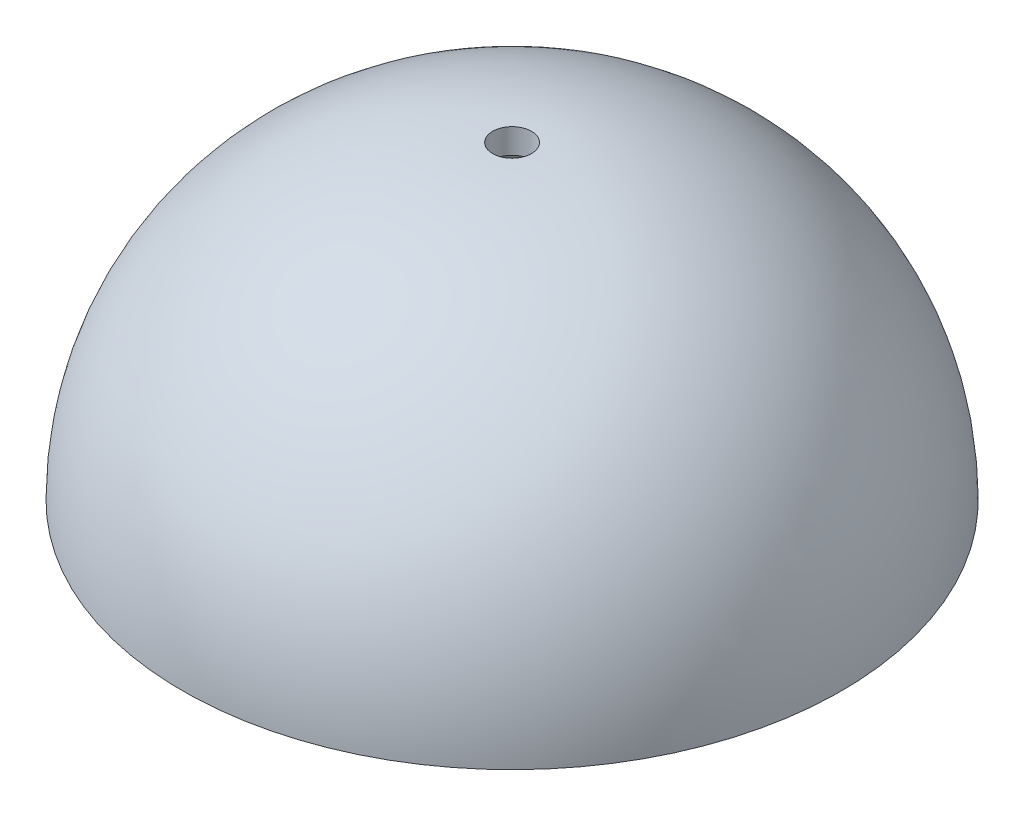
ISO-10303-21;
HEADER;
FILE_DESCRIPTION(('STEP AP214'),'2;1');
FILE_NAME('part.step','',(''),(''),'','','');
FILE_SCHEMA(('AUTOMOTIVE_DESIGN { 1 0 10303 214 1 1 1 1 }'));
ENDSEC;
DATA;
#1=APPLICATION_CONTEXT('core data for automotive mechanical design processes');
#2=APPLICATION_PROTOCOL_DEFINITION('international standard','automotive_design',2000,#1);
#3=PRODUCT_CONTEXT('',#1,'mechanical');
#4=PRODUCT('Part','Part','',(#3));
#5=PRODUCT_RELATED_PRODUCT_CATEGORY('part','',(#4));
#6=PRODUCT_DEFINITION_FORMATION('','',#4);
#7=PRODUCT_DEFINITION_CONTEXT('part definition',#1,'design');
#8=PRODUCT_DEFINITION('design','',#6,#7);
#9=PRODUCT_DEFINITION_SHAPE('','',#8);
#10=(LENGTH_UNIT() NAMED_UNIT(*) SI_UNIT(.MILLI.,.METRE.));
#11=(NAMED_UNIT(*) PLANE_ANGLE_UNIT() SI_UNIT($,.RADIAN.));
#12=(NAMED_UNIT(*) SI_UNIT($,.STERADIAN.) SOLID_ANGLE_UNIT());
#13=UNCERTAINTY_MEASURE_WITH_UNIT(LENGTH_MEASURE(1.E-05),#10,'distance_accuracy_value','');
#14=(GEOMETRIC_REPRESENTATION_CONTEXT(3) GLOBAL_UNCERTAINTY_ASSIGNED_CONTEXT((#13)) GLOBAL_UNIT_ASSIGNED_CONTEXT((#10,
#11,#12)) REPRESENTATION_CONTEXT('',''));
#15=CARTESIAN_POINT('',(0.,0.,0.));
#16=DIRECTION('',(0.,0.,1.));
#17=DIRECTION('',(1.,0.,0.));
#18=AXIS2_PLACEMENT_3D('',#15,#16,#17);
#19=CARTESIAN_POINT('',(-0.794313715105027,0.00704073508814728,0.));
#20=DIRECTION('',(0.,-1.,0.));
#21=DIRECTION('',(0.,0.,-1.));
#22=AXIS2_PLACEMENT_3D('',#19,#20,#21);
#23=DEGENERATE_TOROIDAL_SURFACE('',#22,0.79375,12.6929594212971,.T.);
#24=CARTESIAN_POINT('',(-0.794313715105027,12.7000001563852,0.));
#25=DIRECTION('',(0.,-1.,0.));
#26=DIRECTION('',(0.,0.,-1.));
#27=AXIS2_PLACEMENT_3D('',#24,#25,#26);
#28=CIRCLE('',#27,0.793749999999996);
#29=CARTESIAN_POINT('',(-0.794313715105027,12.7000001563852,-0.793749999999996));
#30=VERTEX_POINT('',#29);
#31=EDGE_CURVE('E43',#30,#30,#28,.T.);
#32=ORIENTED_EDGE('',*,*,#31,.T.);
#33=EDGE_LOOP('',(#32));
#34=FACE_BOUND('',#33,.T.);
#35=CARTESIAN_POINT('',(-0.794313715105027,0.00704073508815195,0.));
#36=DIRECTION('',(0.,-1.,0.));
#37=DIRECTION('',(0.,0.,-1.));
#38=AXIS2_PLACEMENT_3D('',#35,#36,#37);
#39=CIRCLE('',#38,13.4867094212971);
#40=CARTESIAN_POINT('',(-0.794313715105027,0.00704073508815195,-13.4867094212971));
#41=VERTEX_POINT('',#40);
#42=EDGE_CURVE('E10',#41,#41,#39,.T.);
#43=ORIENTED_EDGE('',*,*,#42,.F.);
#44=EDGE_LOOP('',(#43));
#45=FACE_BOUND('',#44,.T.);
#46=ADVANCED_FACE('F29',(#34,#45),#23,.T.);
#47=CARTESIAN_POINT('',(11.676395706192,0.00704073508815292,0.));
#48=DIRECTION('',(0.,-1.,0.));
#49=DIRECTION('',(0.,0.,-1.));
#50=AXIS2_PLACEMENT_3D('',#47,#48,#49);
#51=PLANE('',#50);
#52=ORIENTED_EDGE('',*,*,#42,.T.);
#53=EDGE_LOOP('',(#52));
#54=FACE_BOUND('',#53,.T.);
#55=CARTESIAN_POINT('',(-0.794313715105027,0.0070407350881539,0.));
#56=DIRECTION('',(0.,-1.,0.));
#57=DIRECTION('',(0.,0.,-1.));
#58=AXIS2_PLACEMENT_3D('',#55,#56,#57);
#59=CIRCLE('',#58,12.4707094212971);
#60=CARTESIAN_POINT('',(-0.794313715105027,0.0070407350881539,-12.4707094212971));
#61=VERTEX_POINT('',#60);
#62=EDGE_CURVE('E35',#61,#61,#59,.T.);
#63=ORIENTED_EDGE('',*,*,#62,.F.);
#64=EDGE_LOOP('',(#63));
#65=FACE_BOUND('',#64,.T.);
#66=ADVANCED_FACE('F59',(#54,#65),#51,.T.);
#67=CARTESIAN_POINT('',(-0.794313715105027,0.00704073508814728,0.));
#68=DIRECTION('',(0.,-1.,0.));
#69=DIRECTION('',(0.,0.,-1.));
#70=AXIS2_PLACEMENT_3D('',#67,#68,#69);
#71=DEGENERATE_TOROIDAL_SURFACE('',#70,0.79375,11.6769594212971,.T.);
#72=ORIENTED_EDGE('',*,*,#62,.T.);
#73=EDGE_LOOP('',(#72));
#74=FACE_BOUND('',#73,.T.);
#75=CARTESIAN_POINT('',(-0.794313715105027,11.6840001563852,0.));
#76=DIRECTION('',(0.,-1.,0.));
#77=DIRECTION('',(0.,0.,-1.));
#78=AXIS2_PLACEMENT_3D('',#75,#76,#77);
#79=CIRCLE('',#78,0.793749999999999);
#80=CARTESIAN_POINT('',(-0.794313715105027,11.6840001563852,-0.793749999999999));
#81=VERTEX_POINT('',#80);
#82=EDGE_CURVE('E39',#81,#81,#79,.T.);
#83=ORIENTED_EDGE('',*,*,#82,.F.);
#84=EDGE_LOOP('',(#83));
#85=FACE_BOUND('',#84,.T.);
#86=ADVANCED_FACE('F53',(#74,#85),#71,.F.);
#87=CARTESIAN_POINT('',(-0.794313715105027,0.00704253243434503,0.));
#88=DIRECTION('',(0.,-1.,0.));
#89=DIRECTION('',(0.,0.,-1.));
#90=AXIS2_PLACEMENT_3D('',#87,#88,#89);
#91=CYLINDRICAL_SURFACE('',#90,0.793749999999997);
#92=ORIENTED_EDGE('',*,*,#82,.T.);
#93=EDGE_LOOP('',(#92));
#94=FACE_BOUND('',#93,.T.);
#95=ORIENTED_EDGE('',*,*,#31,.F.);
#96=EDGE_LOOP('',(#95));
#97=FACE_BOUND('',#96,.T.);
#98=ADVANCED_FACE('F51',(#94,#97),#91,.F.);
#99=CLOSED_SHELL('',(#46,#66,#86,#98));
#100=MANIFOLD_SOLID_BREP('B2',#99);
#101=ADVANCED_BREP_SHAPE_REPRESENTATION('',(#18,#100),#14);
#102=SHAPE_DEFINITION_REPRESENTATION(#9,#101);
ENDSEC;
END-ISO-10303-21;
